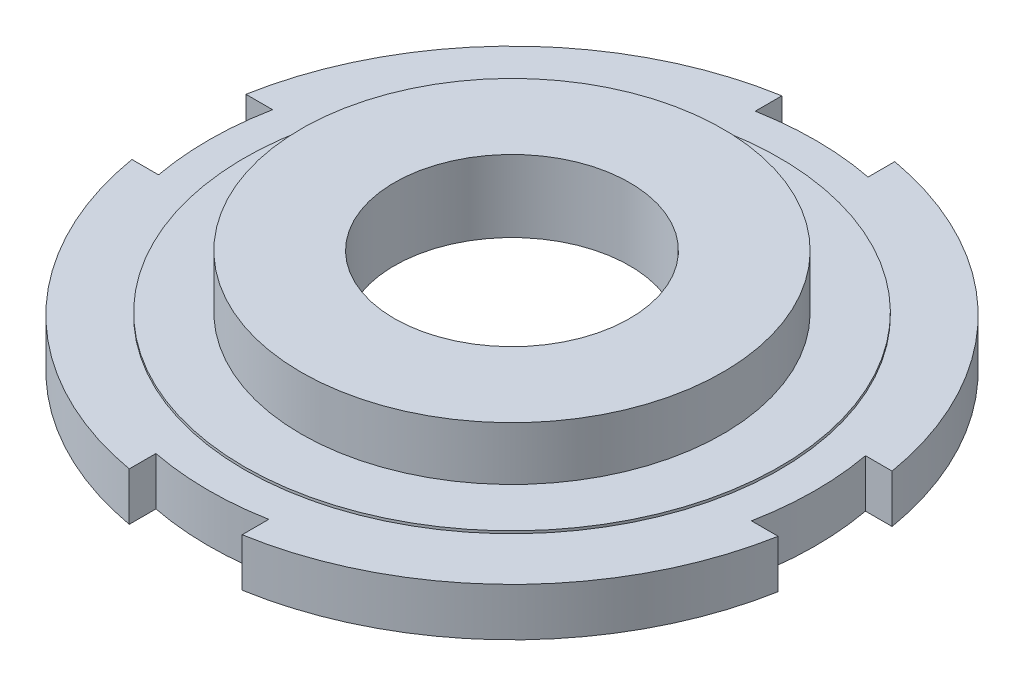
ISO-10303-21;
HEADER;
FILE_DESCRIPTION(('STEP AP214'),'2;1');
FILE_NAME('part.step','',(''),(''),'','','');
FILE_SCHEMA(('AUTOMOTIVE_DESIGN { 1 0 10303 214 1 1 1 1 }'));
ENDSEC;
DATA;
#1=APPLICATION_CONTEXT('core data for automotive mechanical design processes');
#2=APPLICATION_PROTOCOL_DEFINITION('international standard','automotive_design',2000,#1);
#3=PRODUCT_CONTEXT('',#1,'mechanical');
#4=PRODUCT('Part','Part','',(#3));
#5=PRODUCT_RELATED_PRODUCT_CATEGORY('part','',(#4));
#6=PRODUCT_DEFINITION_FORMATION('','',#4);
#7=PRODUCT_DEFINITION_CONTEXT('part definition',#1,'design');
#8=PRODUCT_DEFINITION('design','',#6,#7);
#9=PRODUCT_DEFINITION_SHAPE('','',#8);
#10=(LENGTH_UNIT() NAMED_UNIT(*) SI_UNIT(.MILLI.,.METRE.));
#11=(NAMED_UNIT(*) PLANE_ANGLE_UNIT() SI_UNIT($,.RADIAN.));
#12=(NAMED_UNIT(*) SI_UNIT($,.STERADIAN.) SOLID_ANGLE_UNIT());
#13=UNCERTAINTY_MEASURE_WITH_UNIT(LENGTH_MEASURE(1.E-05),#10,'distance_accuracy_value','');
#14=(GEOMETRIC_REPRESENTATION_CONTEXT(3) GLOBAL_UNCERTAINTY_ASSIGNED_CONTEXT((#13)) GLOBAL_UNIT_ASSIGNED_CONTEXT((#10,
#11,#12)) REPRESENTATION_CONTEXT('',''));
#15=CARTESIAN_POINT('',(0.,0.,0.));
#16=DIRECTION('',(0.,0.,1.));
#17=DIRECTION('',(1.,0.,0.));
#18=AXIS2_PLACEMENT_3D('',#15,#16,#17);
#19=CARTESIAN_POINT('',(0.,6.0000007,0.));
#20=DIRECTION('',(0.,1.,0.));
#21=DIRECTION('',(0.,0.,1.));
#22=AXIS2_PLACEMENT_3D('',#19,#20,#21);
#23=PLANE('',#22);
#24=CARTESIAN_POINT('',(0.,6.0000007,0.));
#25=DIRECTION('',(0.,1.,0.));
#26=DIRECTION('',(0.,0.,1.));
#27=AXIS2_PLACEMENT_3D('',#24,#25,#26);
#28=CIRCLE('',#27,25.019);
#29=CARTESIAN_POINT('',(0.,6.0000007,25.019));
#30=VERTEX_POINT('',#29);
#31=EDGE_CURVE('E347',#30,#30,#28,.T.);
#32=ORIENTED_EDGE('',*,*,#31,.F.);
#33=EDGE_LOOP('',(#32));
#34=FACE_BOUND('',#33,.T.);
#35=CARTESIAN_POINT('',(0.,6.0000007,0.));
#36=DIRECTION('',(0.,1.,0.));
#37=DIRECTION('',(0.,0.,1.));
#38=AXIS2_PLACEMENT_3D('',#35,#36,#37);
#39=CIRCLE('',#38,31.75);
#40=CARTESIAN_POINT('',(0.,6.0000007,31.75));
#41=VERTEX_POINT('',#40);
#42=EDGE_CURVE('E407',#41,#41,#39,.T.);
#43=ORIENTED_EDGE('',*,*,#42,.T.);
#44=EDGE_LOOP('',(#43));
#45=FACE_BOUND('',#44,.T.);
#46=ADVANCED_FACE('F37',(#34,#45),#23,.T.);
#47=CARTESIAN_POINT('',(0.,6.0000007,0.));
#48=DIRECTION('',(0.,-1.,0.));
#49=DIRECTION('',(0.,0.,-1.));
#50=AXIS2_PLACEMENT_3D('',#47,#48,#49);
#51=CYLINDRICAL_SURFACE('',#50,36.0045);
#52=CARTESIAN_POINT('',(0.,5.7000007,0.));
#53=DIRECTION('',(0.,1.,0.));
#54=DIRECTION('',(0.,0.,1.));
#55=AXIS2_PLACEMENT_3D('',#52,#53,#54);
#56=CIRCLE('',#55,36.0045);
#57=CARTESIAN_POINT('',(35.332942956963,5.7000007,6.9215));
#58=VERTEX_POINT('',#57);
#59=CARTESIAN_POINT('',(35.4054498629801,5.7000007,-6.5405));
#60=VERTEX_POINT('',#59);
#61=EDGE_CURVE('E185',#58,#60,#56,.T.);
#62=ORIENTED_EDGE('',*,*,#61,.F.);
#63=DIRECTION('',(0.,-1.,0.));
#64=VECTOR('',#63,1.);
#65=CARTESIAN_POINT('',(35.332942956963,6.0000007,6.9215));
#66=LINE('',#65,#64);
#67=CARTESIAN_POINT('',(35.332942956963,0.,6.9215));
#68=VERTEX_POINT('',#67);
#69=EDGE_CURVE('E193',#58,#68,#66,.T.);
#70=ORIENTED_EDGE('',*,*,#69,.T.);
#71=CARTESIAN_POINT('',(0.,0.,0.));
#72=DIRECTION('',(0.,1.,0.));
#73=DIRECTION('',(0.,0.,1.));
#74=AXIS2_PLACEMENT_3D('',#71,#72,#73);
#75=CIRCLE('',#74,36.0045);
#76=CARTESIAN_POINT('',(35.4054498629801,0.,-6.5405));
#77=VERTEX_POINT('',#76);
#78=EDGE_CURVE('E286',#68,#77,#75,.T.);
#79=ORIENTED_EDGE('',*,*,#78,.T.);
#80=DIRECTION('',(0.,-1.,0.));
#81=VECTOR('',#80,1.);
#82=CARTESIAN_POINT('',(35.4054498629801,6.0000007,-6.5405));
#83=LINE('',#82,#81);
#84=EDGE_CURVE('E195',#60,#77,#83,.T.);
#85=ORIENTED_EDGE('',*,*,#84,.F.);
#86=EDGE_LOOP('',(#62,#70,#79,#85));
#87=FACE_BOUND('',#86,.T.);
#88=ADVANCED_FACE('F39',(#87),#51,.T.);
#89=CARTESIAN_POINT('',(35.4054498629801,6.0000007,-6.5405));
#90=DIRECTION('',(0.,0.,-1.));
#91=DIRECTION('',(-1.,0.,0.));
#92=AXIS2_PLACEMENT_3D('',#89,#90,#91);
#93=PLANE('',#92);
#94=DIRECTION('',(1.,0.,0.));
#95=VECTOR('',#94,1.);
#96=CARTESIAN_POINT('',(35.4054498629801,5.7000007,-6.5405));
#97=LINE('',#96,#95);
#98=CARTESIAN_POINT('',(38.5653123382918,5.7000007,-6.5405));
#99=VERTEX_POINT('',#98);
#100=EDGE_CURVE('E197',#60,#99,#97,.T.);
#101=ORIENTED_EDGE('',*,*,#100,.F.);
#102=ORIENTED_EDGE('',*,*,#84,.T.);
#103=DIRECTION('',(1.,0.,0.));
#104=VECTOR('',#103,1.);
#105=CARTESIAN_POINT('',(35.4054498629801,0.,-6.5405));
#106=LINE('',#105,#104);
#107=CARTESIAN_POINT('',(38.5653123382918,0.,-6.5405));
#108=VERTEX_POINT('',#107);
#109=EDGE_CURVE('E288',#77,#108,#106,.T.);
#110=ORIENTED_EDGE('',*,*,#109,.T.);
#111=DIRECTION('',(0.,-1.,0.));
#112=VECTOR('',#111,1.);
#113=CARTESIAN_POINT('',(38.5653123382918,6.0000007,-6.5405));
#114=LINE('',#113,#112);
#115=EDGE_CURVE('E234',#99,#108,#114,.T.);
#116=ORIENTED_EDGE('',*,*,#115,.F.);
#117=EDGE_LOOP('',(#101,#102,#110,#116));
#118=FACE_BOUND('',#117,.T.);
#119=ADVANCED_FACE('F337',(#118),#93,.F.);
#120=CARTESIAN_POINT('',(0.,6.0000007,0.));
#121=DIRECTION('',(0.,-1.,0.));
#122=DIRECTION('',(0.,0.,-1.));
#123=AXIS2_PLACEMENT_3D('',#120,#121,#122);
#124=CYLINDRICAL_SURFACE('',#123,39.116);
#125=CARTESIAN_POINT('',(0.,5.7000007,0.));
#126=DIRECTION('',(0.,1.,0.));
#127=DIRECTION('',(0.,0.,1.));
#128=AXIS2_PLACEMENT_3D('',#125,#126,#127);
#129=CIRCLE('',#128,39.116);
#130=CARTESIAN_POINT('',(6.92149999999999,5.7000007,-38.4987570416241));
#131=VERTEX_POINT('',#130);
#132=EDGE_CURVE('E339',#99,#131,#129,.T.);
#133=ORIENTED_EDGE('',*,*,#132,.F.);
#134=ORIENTED_EDGE('',*,*,#115,.T.);
#135=CARTESIAN_POINT('',(0.,0.,0.));
#136=DIRECTION('',(0.,1.,0.));
#137=DIRECTION('',(0.,0.,1.));
#138=AXIS2_PLACEMENT_3D('',#135,#136,#137);
#139=CIRCLE('',#138,39.116);
#140=CARTESIAN_POINT('',(6.92149999999998,0.,-38.4987570416241));
#141=VERTEX_POINT('',#140);
#142=EDGE_CURVE('E291',#108,#141,#139,.T.);
#143=ORIENTED_EDGE('',*,*,#142,.T.);
#144=DIRECTION('',(0.,-1.,0.));
#145=VECTOR('',#144,1.);
#146=CARTESIAN_POINT('',(6.92149999999998,6.0000007,-38.4987570416241));
#147=LINE('',#146,#145);
#148=EDGE_CURVE('E232',#131,#141,#147,.T.);
#149=ORIENTED_EDGE('',*,*,#148,.F.);
#150=EDGE_LOOP('',(#133,#134,#143,#149));
#151=FACE_BOUND('',#150,.T.);
#152=ADVANCED_FACE('F381',(#151),#124,.T.);
#153=CARTESIAN_POINT('',(6.92149999999999,6.0000007,-35.332942956963));
#154=DIRECTION('',(1.,0.,0.));
#155=DIRECTION('',(0.,0.,-1.));
#156=AXIS2_PLACEMENT_3D('',#153,#154,#155);
#157=PLANE('',#156);
#158=DIRECTION('',(0.,0.,1.));
#159=VECTOR('',#158,1.);
#160=CARTESIAN_POINT('',(6.92149999999999,5.7000007,-35.332942956963));
#161=LINE('',#160,#159);
#162=CARTESIAN_POINT('',(6.92149999999999,5.7000007,-35.332942956963));
#163=VERTEX_POINT('',#162);
#164=EDGE_CURVE('E341',#131,#163,#161,.T.);
#165=ORIENTED_EDGE('',*,*,#164,.F.);
#166=ORIENTED_EDGE('',*,*,#148,.T.);
#167=DIRECTION('',(0.,0.,1.));
#168=VECTOR('',#167,1.);
#169=CARTESIAN_POINT('',(6.92149999999999,0.,-35.332942956963));
#170=LINE('',#169,#168);
#171=CARTESIAN_POINT('',(6.92149999999999,0.,-35.332942956963));
#172=VERTEX_POINT('',#171);
#173=EDGE_CURVE('E294',#141,#172,#170,.T.);
#174=ORIENTED_EDGE('',*,*,#173,.T.);
#175=DIRECTION('',(0.,-1.,0.));
#176=VECTOR('',#175,1.);
#177=CARTESIAN_POINT('',(6.92149999999999,6.0000007,-35.332942956963));
#178=LINE('',#177,#176);
#179=EDGE_CURVE('E230',#163,#172,#178,.T.);
#180=ORIENTED_EDGE('',*,*,#179,.F.);
#181=EDGE_LOOP('',(#165,#166,#174,#180));
#182=FACE_BOUND('',#181,.T.);
#183=ADVANCED_FACE('F378',(#182),#157,.F.);
#184=CARTESIAN_POINT('',(0.,6.0000007,0.));
#185=DIRECTION('',(0.,-1.,0.));
#186=DIRECTION('',(0.,0.,-1.));
#187=AXIS2_PLACEMENT_3D('',#184,#185,#186);
#188=CYLINDRICAL_SURFACE('',#187,36.0045);
#189=CARTESIAN_POINT('',(0.,5.7000007,0.));
#190=DIRECTION('',(0.,1.,0.));
#191=DIRECTION('',(0.,0.,1.));
#192=AXIS2_PLACEMENT_3D('',#189,#190,#191);
#193=CIRCLE('',#192,36.0045);
#194=CARTESIAN_POINT('',(-6.54050000000001,5.7000007,-35.4054498629801));
#195=VERTEX_POINT('',#194);
#196=EDGE_CURVE('E382',#163,#195,#193,.T.);
#197=ORIENTED_EDGE('',*,*,#196,.F.);
#198=ORIENTED_EDGE('',*,*,#179,.T.);
#199=CARTESIAN_POINT('',(0.,0.,0.));
#200=DIRECTION('',(0.,1.,0.));
#201=DIRECTION('',(0.,0.,1.));
#202=AXIS2_PLACEMENT_3D('',#199,#200,#201);
#203=CIRCLE('',#202,36.0045);
#204=CARTESIAN_POINT('',(2.43042801212387,0.,-35.9223751988629));
#205=VERTEX_POINT('',#204);
#206=EDGE_CURVE('E297',#172,#205,#203,.T.);
#207=ORIENTED_EDGE('',*,*,#206,.T.);
#208=DIRECTION('',(0.,-1.,0.));
#209=VECTOR('',#208,1.);
#210=CARTESIAN_POINT('',(2.43042801212387,6.0000007,-35.9223751988629));
#211=LINE('',#210,#209);
#212=CARTESIAN_POINT('',(2.43042801212387,3.81,-35.9223751988629));
#213=VERTEX_POINT('',#212);
#214=EDGE_CURVE('E245',#205,#213,#211,.F.);
#215=ORIENTED_EDGE('',*,*,#214,.T.);
#216=CARTESIAN_POINT('',(0.,3.81,0.));
#217=DIRECTION('',(0.,1.,0.));
#218=DIRECTION('',(0.,0.,1.));
#219=AXIS2_PLACEMENT_3D('',#216,#217,#218);
#220=CIRCLE('',#219,36.0045);
#221=CARTESIAN_POINT('',(-1.98478682303275,3.81,-35.949751619686));
#222=VERTEX_POINT('',#221);
#223=EDGE_CURVE('E241',#213,#222,#220,.T.);
#224=ORIENTED_EDGE('',*,*,#223,.T.);
#225=DIRECTION('',(0.,-1.,0.));
#226=VECTOR('',#225,1.);
#227=CARTESIAN_POINT('',(-1.98478682303275,6.0000007,-35.949751619686));
#228=LINE('',#227,#226);
#229=CARTESIAN_POINT('',(-1.98478682303275,0.,-35.949751619686));
#230=VERTEX_POINT('',#229);
#231=EDGE_CURVE('E237',#222,#230,#228,.T.);
#232=ORIENTED_EDGE('',*,*,#231,.T.);
#233=CARTESIAN_POINT('',(-6.5405,0.,-35.4054498629801));
#234=VERTEX_POINT('',#233);
#235=EDGE_CURVE('E267',#230,#234,#203,.T.);
#236=ORIENTED_EDGE('',*,*,#235,.T.);
#237=DIRECTION('',(0.,-1.,0.));
#238=VECTOR('',#237,1.);
#239=CARTESIAN_POINT('',(-6.5405,6.0000007,-35.4054498629801));
#240=LINE('',#239,#238);
#241=EDGE_CURVE('E228',#195,#234,#240,.T.);
#242=ORIENTED_EDGE('',*,*,#241,.F.);
#243=EDGE_LOOP('',(#197,#198,#207,#215,#224,#232,#236,#242));
#244=FACE_BOUND('',#243,.T.);
#245=ADVANCED_FACE('F373',(#244),#188,.T.);
#246=CARTESIAN_POINT('',(-6.54050000000001,6.0000007,-35.4054498629801));
#247=DIRECTION('',(-1.,0.,0.));
#248=DIRECTION('',(0.,0.,1.));
#249=AXIS2_PLACEMENT_3D('',#246,#247,#248);
#250=PLANE('',#249);
#251=DIRECTION('',(0.,0.,-1.));
#252=VECTOR('',#251,1.);
#253=CARTESIAN_POINT('',(-6.54050000000001,5.7000007,-35.4054498629801));
#254=LINE('',#253,#252);
#255=CARTESIAN_POINT('',(-6.54050000000001,5.7000007,-38.5653123382918));
#256=VERTEX_POINT('',#255);
#257=EDGE_CURVE('E385',#195,#256,#254,.T.);
#258=ORIENTED_EDGE('',*,*,#257,.F.);
#259=ORIENTED_EDGE('',*,*,#241,.T.);
#260=DIRECTION('',(0.,0.,-1.));
#261=VECTOR('',#260,1.);
#262=CARTESIAN_POINT('',(-6.54050000000001,0.,-35.4054498629801));
#263=LINE('',#262,#261);
#264=CARTESIAN_POINT('',(-6.54050000000001,0.,-38.5653123382918));
#265=VERTEX_POINT('',#264);
#266=EDGE_CURVE('E300',#234,#265,#263,.T.);
#267=ORIENTED_EDGE('',*,*,#266,.T.);
#268=DIRECTION('',(0.,-1.,0.));
#269=VECTOR('',#268,1.);
#270=CARTESIAN_POINT('',(-6.54050000000001,6.0000007,-38.5653123382918));
#271=LINE('',#270,#269);
#272=EDGE_CURVE('E226',#256,#265,#271,.T.);
#273=ORIENTED_EDGE('',*,*,#272,.F.);
#274=EDGE_LOOP('',(#258,#259,#267,#273));
#275=FACE_BOUND('',#274,.T.);
#276=ADVANCED_FACE('F477',(#275),#250,.F.);
#277=CARTESIAN_POINT('',(0.,6.0000007,0.));
#278=DIRECTION('',(0.,-1.,0.));
#279=DIRECTION('',(0.,0.,-1.));
#280=AXIS2_PLACEMENT_3D('',#277,#278,#279);
#281=CYLINDRICAL_SURFACE('',#280,39.116);
#282=CARTESIAN_POINT('',(0.,5.7000007,0.));
#283=DIRECTION('',(0.,1.,0.));
#284=DIRECTION('',(0.,0.,1.));
#285=AXIS2_PLACEMENT_3D('',#282,#283,#284);
#286=CIRCLE('',#285,39.116);
#287=CARTESIAN_POINT('',(-38.4987570416241,5.7000007,-6.9215));
#288=VERTEX_POINT('',#287);
#289=EDGE_CURVE('E387',#256,#288,#286,.T.);
#290=ORIENTED_EDGE('',*,*,#289,.F.);
#291=ORIENTED_EDGE('',*,*,#272,.T.);
#292=CARTESIAN_POINT('',(0.,0.,0.));
#293=DIRECTION('',(0.,1.,0.));
#294=DIRECTION('',(0.,0.,1.));
#295=AXIS2_PLACEMENT_3D('',#292,#293,#294);
#296=CIRCLE('',#295,39.116);
#297=CARTESIAN_POINT('',(-38.4987570416241,0.,-6.92149999999999));
#298=VERTEX_POINT('',#297);
#299=EDGE_CURVE('E303',#265,#298,#296,.T.);
#300=ORIENTED_EDGE('',*,*,#299,.T.);
#301=DIRECTION('',(0.,-1.,0.));
#302=VECTOR('',#301,1.);
#303=CARTESIAN_POINT('',(-38.4987570416241,6.0000007,-6.92149999999999));
#304=LINE('',#303,#302);
#305=EDGE_CURVE('E224',#288,#298,#304,.T.);
#306=ORIENTED_EDGE('',*,*,#305,.F.);
#307=EDGE_LOOP('',(#290,#291,#300,#306));
#308=FACE_BOUND('',#307,.T.);
#309=ADVANCED_FACE('F473',(#308),#281,.T.);
#310=CARTESIAN_POINT('',(-35.332942956963,6.0000007,-6.92149999999999));
#311=DIRECTION('',(0.,0.,-1.));
#312=DIRECTION('',(-1.,0.,0.));
#313=AXIS2_PLACEMENT_3D('',#310,#311,#312);
#314=PLANE('',#313);
#315=DIRECTION('',(1.,0.,0.));
#316=VECTOR('',#315,1.);
#317=CARTESIAN_POINT('',(-35.332942956963,5.7000007,-6.92149999999999));
#318=LINE('',#317,#316);
#319=CARTESIAN_POINT('',(-35.332942956963,5.7000007,-6.92149999999999));
#320=VERTEX_POINT('',#319);
#321=EDGE_CURVE('E391',#288,#320,#318,.T.);
#322=ORIENTED_EDGE('',*,*,#321,.F.);
#323=ORIENTED_EDGE('',*,*,#305,.T.);
#324=DIRECTION('',(1.,0.,0.));
#325=VECTOR('',#324,1.);
#326=CARTESIAN_POINT('',(-35.332942956963,0.,-6.92149999999999));
#327=LINE('',#326,#325);
#328=CARTESIAN_POINT('',(-35.332942956963,0.,-6.92149999999999));
#329=VERTEX_POINT('',#328);
#330=EDGE_CURVE('E306',#298,#329,#327,.T.);
#331=ORIENTED_EDGE('',*,*,#330,.T.);
#332=DIRECTION('',(0.,-1.,0.));
#333=VECTOR('',#332,1.);
#334=CARTESIAN_POINT('',(-35.332942956963,6.0000007,-6.92149999999999));
#335=LINE('',#334,#333);
#336=EDGE_CURVE('E222',#320,#329,#335,.T.);
#337=ORIENTED_EDGE('',*,*,#336,.F.);
#338=EDGE_LOOP('',(#322,#323,#331,#337));
#339=FACE_BOUND('',#338,.T.);
#340=ADVANCED_FACE('F469',(#339),#314,.F.);
#341=CARTESIAN_POINT('',(0.,6.0000007,0.));
#342=DIRECTION('',(0.,-1.,0.));
#343=DIRECTION('',(0.,0.,-1.));
#344=AXIS2_PLACEMENT_3D('',#341,#342,#343);
#345=CYLINDRICAL_SURFACE('',#344,36.0045);
#346=CARTESIAN_POINT('',(0.,5.7000007,0.));
#347=DIRECTION('',(0.,1.,0.));
#348=DIRECTION('',(0.,0.,1.));
#349=AXIS2_PLACEMENT_3D('',#346,#347,#348);
#350=CIRCLE('',#349,36.0045);
#351=CARTESIAN_POINT('',(-35.4054498629801,5.7000007,6.54050000000001));
#352=VERTEX_POINT('',#351);
#353=EDGE_CURVE('E393',#320,#352,#350,.T.);
#354=ORIENTED_EDGE('',*,*,#353,.F.);
#355=ORIENTED_EDGE('',*,*,#336,.T.);
#356=CARTESIAN_POINT('',(0.,0.,0.));
#357=DIRECTION('',(0.,1.,0.));
#358=DIRECTION('',(0.,0.,1.));
#359=AXIS2_PLACEMENT_3D('',#356,#357,#358);
#360=CIRCLE('',#359,36.0045);
#361=CARTESIAN_POINT('',(-35.4054498629801,0.,6.5405));
#362=VERTEX_POINT('',#361);
#363=EDGE_CURVE('E309',#329,#362,#360,.T.);
#364=ORIENTED_EDGE('',*,*,#363,.T.);
#365=DIRECTION('',(0.,-1.,0.));
#366=VECTOR('',#365,1.);
#367=CARTESIAN_POINT('',(-35.4054498629801,6.0000007,6.5405));
#368=LINE('',#367,#366);
#369=EDGE_CURVE('E220',#352,#362,#368,.T.);
#370=ORIENTED_EDGE('',*,*,#369,.F.);
#371=EDGE_LOOP('',(#354,#355,#364,#370));
#372=FACE_BOUND('',#371,.T.);
#373=ADVANCED_FACE('F465',(#372),#345,.T.);
#374=CARTESIAN_POINT('',(-35.4054498629801,6.0000007,6.54050000000001));
#375=DIRECTION('',(0.,0.,1.));
#376=DIRECTION('',(1.,0.,0.));
#377=AXIS2_PLACEMENT_3D('',#374,#375,#376);
#378=PLANE('',#377);
#379=DIRECTION('',(-1.,0.,0.));
#380=VECTOR('',#379,1.);
#381=CARTESIAN_POINT('',(-35.4054498629801,5.7000007,6.54050000000001));
#382=LINE('',#381,#380);
#383=CARTESIAN_POINT('',(-38.5653123382918,5.7000007,6.54050000000001));
#384=VERTEX_POINT('',#383);
#385=EDGE_CURVE('E395',#352,#384,#382,.T.);
#386=ORIENTED_EDGE('',*,*,#385,.F.);
#387=ORIENTED_EDGE('',*,*,#369,.T.);
#388=DIRECTION('',(-1.,0.,0.));
#389=VECTOR('',#388,1.);
#390=CARTESIAN_POINT('',(-35.4054498629801,0.,6.54050000000001));
#391=LINE('',#390,#389);
#392=CARTESIAN_POINT('',(-38.5653123382918,0.,6.54050000000001));
#393=VERTEX_POINT('',#392);
#394=EDGE_CURVE('E312',#362,#393,#391,.T.);
#395=ORIENTED_EDGE('',*,*,#394,.T.);
#396=DIRECTION('',(0.,-1.,0.));
#397=VECTOR('',#396,1.);
#398=CARTESIAN_POINT('',(-38.5653123382918,6.0000007,6.54050000000001));
#399=LINE('',#398,#397);
#400=EDGE_CURVE('E218',#384,#393,#399,.T.);
#401=ORIENTED_EDGE('',*,*,#400,.F.);
#402=EDGE_LOOP('',(#386,#387,#395,#401));
#403=FACE_BOUND('',#402,.T.);
#404=ADVANCED_FACE('F461',(#403),#378,.F.);
#405=CARTESIAN_POINT('',(0.,6.0000007,0.));
#406=DIRECTION('',(0.,-1.,0.));
#407=DIRECTION('',(0.,0.,-1.));
#408=AXIS2_PLACEMENT_3D('',#405,#406,#407);
#409=CYLINDRICAL_SURFACE('',#408,39.116);
#410=CARTESIAN_POINT('',(0.,5.7000007,0.));
#411=DIRECTION('',(0.,1.,0.));
#412=DIRECTION('',(0.,0.,1.));
#413=AXIS2_PLACEMENT_3D('',#410,#411,#412);
#414=CIRCLE('',#413,39.116);
#415=CARTESIAN_POINT('',(-6.9215,5.7000007,38.4987570416241));
#416=VERTEX_POINT('',#415);
#417=EDGE_CURVE('E397',#384,#416,#414,.T.);
#418=ORIENTED_EDGE('',*,*,#417,.F.);
#419=ORIENTED_EDGE('',*,*,#400,.T.);
#420=CARTESIAN_POINT('',(0.,0.,0.));
#421=DIRECTION('',(0.,1.,0.));
#422=DIRECTION('',(0.,0.,1.));
#423=AXIS2_PLACEMENT_3D('',#420,#421,#422);
#424=CIRCLE('',#423,39.116);
#425=CARTESIAN_POINT('',(-6.92149999999999,0.,38.4987570416241));
#426=VERTEX_POINT('',#425);
#427=EDGE_CURVE('E315',#393,#426,#424,.T.);
#428=ORIENTED_EDGE('',*,*,#427,.T.);
#429=DIRECTION('',(0.,-1.,0.));
#430=VECTOR('',#429,1.);
#431=CARTESIAN_POINT('',(-6.92149999999999,6.0000007,38.4987570416241));
#432=LINE('',#431,#430);
#433=EDGE_CURVE('E216',#416,#426,#432,.T.);
#434=ORIENTED_EDGE('',*,*,#433,.F.);
#435=EDGE_LOOP('',(#418,#419,#428,#434));
#436=FACE_BOUND('',#435,.T.);
#437=ADVANCED_FACE('F457',(#436),#409,.T.);
#438=CARTESIAN_POINT('',(-6.9215,6.0000007,35.332942956963));
#439=DIRECTION('',(-1.,0.,0.));
#440=DIRECTION('',(0.,0.,1.));
#441=AXIS2_PLACEMENT_3D('',#438,#439,#440);
#442=PLANE('',#441);
#443=DIRECTION('',(0.,0.,-1.));
#444=VECTOR('',#443,1.);
#445=CARTESIAN_POINT('',(-6.9215,5.7000007,35.332942956963));
#446=LINE('',#445,#444);
#447=CARTESIAN_POINT('',(-6.9215,5.7000007,35.332942956963));
#448=VERTEX_POINT('',#447);
#449=EDGE_CURVE('E399',#416,#448,#446,.T.);
#450=ORIENTED_EDGE('',*,*,#449,.F.);
#451=ORIENTED_EDGE('',*,*,#433,.T.);
#452=DIRECTION('',(0.,0.,-1.));
#453=VECTOR('',#452,1.);
#454=CARTESIAN_POINT('',(-6.9215,0.,35.332942956963));
#455=LINE('',#454,#453);
#456=CARTESIAN_POINT('',(-6.9215,0.,35.332942956963));
#457=VERTEX_POINT('',#456);
#458=EDGE_CURVE('E318',#426,#457,#455,.T.);
#459=ORIENTED_EDGE('',*,*,#458,.T.);
#460=DIRECTION('',(0.,-1.,0.));
#461=VECTOR('',#460,1.);
#462=CARTESIAN_POINT('',(-6.9215,6.0000007,35.332942956963));
#463=LINE('',#462,#461);
#464=EDGE_CURVE('E214',#448,#457,#463,.T.);
#465=ORIENTED_EDGE('',*,*,#464,.F.);
#466=EDGE_LOOP('',(#450,#451,#459,#465));
#467=FACE_BOUND('',#466,.T.);
#468=ADVANCED_FACE('F453',(#467),#442,.F.);
#469=CARTESIAN_POINT('',(0.,6.0000007,0.));
#470=DIRECTION('',(0.,-1.,0.));
#471=DIRECTION('',(0.,0.,-1.));
#472=AXIS2_PLACEMENT_3D('',#469,#470,#471);
#473=CYLINDRICAL_SURFACE('',#472,36.0045);
#474=CARTESIAN_POINT('',(0.,5.7000007,0.));
#475=DIRECTION('',(0.,1.,0.));
#476=DIRECTION('',(0.,0.,1.));
#477=AXIS2_PLACEMENT_3D('',#474,#475,#476);
#478=CIRCLE('',#477,36.0045);
#479=CARTESIAN_POINT('',(6.5405,5.7000007,35.4054498629801));
#480=VERTEX_POINT('',#479);
#481=EDGE_CURVE('E401',#448,#480,#478,.T.);
#482=ORIENTED_EDGE('',*,*,#481,.F.);
#483=ORIENTED_EDGE('',*,*,#464,.T.);
#484=CARTESIAN_POINT('',(0.,0.,0.));
#485=DIRECTION('',(0.,1.,0.));
#486=DIRECTION('',(0.,0.,1.));
#487=AXIS2_PLACEMENT_3D('',#484,#485,#486);
#488=CIRCLE('',#487,36.0045);
#489=CARTESIAN_POINT('',(6.54050000000001,0.,35.4054498629801));
#490=VERTEX_POINT('',#489);
#491=EDGE_CURVE('E321',#457,#490,#488,.T.);
#492=ORIENTED_EDGE('',*,*,#491,.T.);
#493=DIRECTION('',(0.,-1.,0.));
#494=VECTOR('',#493,1.);
#495=CARTESIAN_POINT('',(6.54050000000001,6.0000007,35.4054498629801));
#496=LINE('',#495,#494);
#497=EDGE_CURVE('E212',#480,#490,#496,.T.);
#498=ORIENTED_EDGE('',*,*,#497,.F.);
#499=EDGE_LOOP('',(#482,#483,#492,#498));
#500=FACE_BOUND('',#499,.T.);
#501=ADVANCED_FACE('F449',(#500),#473,.T.);
#502=CARTESIAN_POINT('',(6.5405,6.0000007,35.4054498629801));
#503=DIRECTION('',(1.,0.,0.));
#504=DIRECTION('',(0.,0.,-1.));
#505=AXIS2_PLACEMENT_3D('',#502,#503,#504);
#506=PLANE('',#505);
#507=DIRECTION('',(0.,0.,1.));
#508=VECTOR('',#507,1.);
#509=CARTESIAN_POINT('',(6.5405,5.7000007,35.4054498629801));
#510=LINE('',#509,#508);
#511=CARTESIAN_POINT('',(6.5405,5.7000007,38.5653123382918));
#512=VERTEX_POINT('',#511);
#513=EDGE_CURVE('E403',#480,#512,#510,.T.);
#514=ORIENTED_EDGE('',*,*,#513,.F.);
#515=ORIENTED_EDGE('',*,*,#497,.T.);
#516=DIRECTION('',(0.,0.,1.));
#517=VECTOR('',#516,1.);
#518=CARTESIAN_POINT('',(6.5405,0.,35.4054498629801));
#519=LINE('',#518,#517);
#520=CARTESIAN_POINT('',(6.5405,0.,38.5653123382918));
#521=VERTEX_POINT('',#520);
#522=EDGE_CURVE('E324',#490,#521,#519,.T.);
#523=ORIENTED_EDGE('',*,*,#522,.T.);
#524=DIRECTION('',(0.,-1.,0.));
#525=VECTOR('',#524,1.);
#526=CARTESIAN_POINT('',(6.5405,6.0000007,38.5653123382918));
#527=LINE('',#526,#525);
#528=EDGE_CURVE('E205',#512,#521,#527,.T.);
#529=ORIENTED_EDGE('',*,*,#528,.F.);
#530=EDGE_LOOP('',(#514,#515,#523,#529));
#531=FACE_BOUND('',#530,.T.);
#532=ADVANCED_FACE('F446',(#531),#506,.F.);
#533=CARTESIAN_POINT('',(0.,6.0000007,0.));
#534=DIRECTION('',(0.,-1.,0.));
#535=DIRECTION('',(0.,0.,-1.));
#536=AXIS2_PLACEMENT_3D('',#533,#534,#535);
#537=CYLINDRICAL_SURFACE('',#536,39.116);
#538=CARTESIAN_POINT('',(0.,5.7000007,0.));
#539=DIRECTION('',(0.,1.,0.));
#540=DIRECTION('',(0.,0.,1.));
#541=AXIS2_PLACEMENT_3D('',#538,#539,#540);
#542=CIRCLE('',#541,39.116);
#543=CARTESIAN_POINT('',(38.4987570416241,5.7000007,6.9215));
#544=VERTEX_POINT('',#543);
#545=EDGE_CURVE('E51',#512,#544,#542,.T.);
#546=ORIENTED_EDGE('',*,*,#545,.F.);
#547=ORIENTED_EDGE('',*,*,#528,.T.);
#548=CARTESIAN_POINT('',(0.,0.,0.));
#549=DIRECTION('',(0.,1.,0.));
#550=DIRECTION('',(0.,0.,1.));
#551=AXIS2_PLACEMENT_3D('',#548,#549,#550);
#552=CIRCLE('',#551,39.116);
#553=CARTESIAN_POINT('',(38.4987570416241,0.,6.9215));
#554=VERTEX_POINT('',#553);
#555=EDGE_CURVE('E207',#521,#554,#552,.T.);
#556=ORIENTED_EDGE('',*,*,#555,.T.);
#557=DIRECTION('',(0.,-1.,0.));
#558=VECTOR('',#557,1.);
#559=CARTESIAN_POINT('',(38.4987570416241,6.0000007,6.9215));
#560=LINE('',#559,#558);
#561=EDGE_CURVE('E203',#544,#554,#560,.T.);
#562=ORIENTED_EDGE('',*,*,#561,.F.);
#563=EDGE_LOOP('',(#546,#547,#556,#562));
#564=FACE_BOUND('',#563,.T.);
#565=ADVANCED_FACE('F329',(#564),#537,.T.);
#566=CARTESIAN_POINT('',(35.332942956963,6.0000007,6.9215));
#567=DIRECTION('',(0.,0.,1.));
#568=DIRECTION('',(1.,0.,0.));
#569=AXIS2_PLACEMENT_3D('',#566,#567,#568);
#570=PLANE('',#569);
#571=DIRECTION('',(-1.,0.,0.));
#572=VECTOR('',#571,1.);
#573=CARTESIAN_POINT('',(35.332942956963,5.7000007,6.9215));
#574=LINE('',#573,#572);
#575=EDGE_CURVE('E11',#544,#58,#574,.T.);
#576=ORIENTED_EDGE('',*,*,#575,.F.);
#577=ORIENTED_EDGE('',*,*,#561,.T.);
#578=DIRECTION('',(-1.,0.,0.));
#579=VECTOR('',#578,1.);
#580=CARTESIAN_POINT('',(35.332942956963,0.,6.9215));
#581=LINE('',#580,#579);
#582=EDGE_CURVE('E201',#554,#68,#581,.T.);
#583=ORIENTED_EDGE('',*,*,#582,.T.);
#584=ORIENTED_EDGE('',*,*,#69,.F.);
#585=EDGE_LOOP('',(#576,#577,#583,#584));
#586=FACE_BOUND('',#585,.T.);
#587=ADVANCED_FACE('F199',(#586),#570,.F.);
#588=CARTESIAN_POINT('',(0.,3.81,0.));
#589=DIRECTION('',(0.,-1.,0.));
#590=DIRECTION('',(0.,0.,-1.));
#591=AXIS2_PLACEMENT_3D('',#588,#589,#590);
#592=CYLINDRICAL_SURFACE('',#591,20.066);
#593=CARTESIAN_POINT('',(0.,0.3,0.));
#594=DIRECTION('',(0.,-1.,0.));
#595=DIRECTION('',(0.,0.,-1.));
#596=AXIS2_PLACEMENT_3D('',#593,#594,#595);
#597=CIRCLE('',#596,20.066);
#598=CARTESIAN_POINT('',(8.19621258604991,0.300000000000001,-18.3157433713261));
#599=VERTEX_POINT('',#598);
#600=CARTESIAN_POINT('',(17.3776657523386,0.3,-10.033));
#601=VERTEX_POINT('',#600);
#602=EDGE_CURVE('E248',#599,#601,#597,.F.);
#603=ORIENTED_EDGE('',*,*,#602,.F.);
#604=DIRECTION('',(0.,-1.,0.));
#605=VECTOR('',#604,1.);
#606=CARTESIAN_POINT('',(8.19621258604991,3.81,-18.3157433713261));
#607=LINE('',#606,#605);
#608=CARTESIAN_POINT('',(8.19621258604991,3.81,-18.3157433713261));
#609=VERTEX_POINT('',#608);
#610=EDGE_CURVE('E282',#609,#599,#607,.T.);
#611=ORIENTED_EDGE('',*,*,#610,.F.);
#612=CARTESIAN_POINT('',(0.,3.81,0.));
#613=DIRECTION('',(0.,-1.,0.));
#614=DIRECTION('',(0.,0.,1.));
#615=AXIS2_PLACEMENT_3D('',#612,#613,#614);
#616=CIRCLE('',#615,20.066);
#617=CARTESIAN_POINT('',(17.3776657523386,3.81,-10.033));
#618=VERTEX_POINT('',#617);
#619=EDGE_CURVE('E271',#618,#609,#616,.T.);
#620=ORIENTED_EDGE('',*,*,#619,.F.);
#621=DIRECTION('',(0.,-1.,0.));
#622=VECTOR('',#621,1.);
#623=CARTESIAN_POINT('',(17.3776657523386,3.81,-10.033));
#624=LINE('',#623,#622);
#625=EDGE_CURVE('E242',#618,#601,#624,.T.);
#626=ORIENTED_EDGE('',*,*,#625,.T.);
#627=EDGE_LOOP('',(#603,#611,#620,#626));
#628=FACE_BOUND('',#627,.T.);
#629=ADVANCED_FACE('F370',(#628),#592,.F.);
#630=CARTESIAN_POINT('',(0.,0.,0.));
#631=DIRECTION('',(0.,1.,0.));
#632=DIRECTION('',(0.,0.,1.));
#633=AXIS2_PLACEMENT_3D('',#630,#631,#632);
#634=PLANE('',#633);
#635=DIRECTION('',(-0.500000000000001,0.,-0.866025403784438));
#636=VECTOR('',#635,1.);
#637=CARTESIAN_POINT('',(-4.5396617454955,0.,-40.374924792375));
#638=LINE('',#637,#636);
#639=CARTESIAN_POINT('',(0.441714975771824,0.,-31.7469272194992));
#640=VERTEX_POINT('',#639);
#641=EDGE_CURVE('E254',#640,#230,#638,.T.);
#642=ORIENTED_EDGE('',*,*,#641,.F.);
#643=CARTESIAN_POINT('',(0.,0.,0.));
#644=DIRECTION('',(0.,-1.,0.));
#645=DIRECTION('',(0.,0.,-1.));
#646=AXIS2_PLACEMENT_3D('',#643,#644,#645);
#647=CIRCLE('',#646,31.75);
#648=CARTESIAN_POINT('',(5.07504261741328,0.,-31.341768336063));
#649=VERTEX_POINT('',#648);
#650=EDGE_CURVE('E263',#649,#640,#647,.T.);
#651=ORIENTED_EDGE('',*,*,#650,.F.);
#652=DIRECTION('',(0.499999999999999,0.,0.866025403784439));
#653=VECTOR('',#652,1.);
#654=CARTESIAN_POINT('',(17.3776657523386,0.,-10.033));
#655=LINE('',#654,#653);
#656=EDGE_CURVE('E268',#205,#649,#655,.T.);
#657=ORIENTED_EDGE('',*,*,#656,.F.);
#658=ORIENTED_EDGE('',*,*,#206,.F.);
#659=ORIENTED_EDGE('',*,*,#173,.F.);
#660=ORIENTED_EDGE('',*,*,#142,.F.);
#661=ORIENTED_EDGE('',*,*,#109,.F.);
#662=ORIENTED_EDGE('',*,*,#78,.F.);
#663=ORIENTED_EDGE('',*,*,#582,.F.);
#664=ORIENTED_EDGE('',*,*,#555,.F.);
#665=ORIENTED_EDGE('',*,*,#522,.F.);
#666=ORIENTED_EDGE('',*,*,#491,.F.);
#667=ORIENTED_EDGE('',*,*,#458,.F.);
#668=ORIENTED_EDGE('',*,*,#427,.F.);
#669=ORIENTED_EDGE('',*,*,#394,.F.);
#670=ORIENTED_EDGE('',*,*,#363,.F.);
#671=ORIENTED_EDGE('',*,*,#330,.F.);
#672=ORIENTED_EDGE('',*,*,#299,.F.);
#673=ORIENTED_EDGE('',*,*,#266,.F.);
#674=ORIENTED_EDGE('',*,*,#235,.F.);
#675=EDGE_LOOP('',(#642,#651,#657,#658,#659,#660,#661,#662,#663,#664,#665,#666,#667,#668,#669,
#670,#671,#672,#673,#674));
#676=FACE_BOUND('',#675,.T.);
#677=ADVANCED_FACE('F261',(#676),#634,.F.);
#678=CARTESIAN_POINT('',(0.,6.0000007,0.));
#679=DIRECTION('',(0.,-1.,0.));
#680=DIRECTION('',(0.,0.,-1.));
#681=AXIS2_PLACEMENT_3D('',#678,#679,#680);
#682=CYLINDRICAL_SURFACE('',#681,13.97);
#683=CARTESIAN_POINT('',(0.,3.81,0.));
#684=DIRECTION('',(0.,1.,0.));
#685=DIRECTION('',(0.,0.,1.));
#686=AXIS2_PLACEMENT_3D('',#683,#684,#685);
#687=CIRCLE('',#686,13.97);
#688=CARTESIAN_POINT('',(0.,3.81,13.97));
#689=VERTEX_POINT('',#688);
#690=EDGE_CURVE('E238',#689,#689,#687,.T.);
#691=ORIENTED_EDGE('',*,*,#690,.F.);
#692=EDGE_LOOP('',(#691));
#693=FACE_BOUND('',#692,.T.);
#694=CARTESIAN_POINT('',(0.,12.3500007,0.));
#695=DIRECTION('',(0.,1.,0.));
#696=DIRECTION('',(0.,0.,1.));
#697=AXIS2_PLACEMENT_3D('',#694,#695,#696);
#698=CIRCLE('',#697,13.97);
#699=CARTESIAN_POINT('',(0.,12.3500007,13.97));
#700=VERTEX_POINT('',#699);
#701=EDGE_CURVE('E196',#700,#700,#698,.T.);
#702=ORIENTED_EDGE('',*,*,#701,.T.);
#703=EDGE_LOOP('',(#702));
#704=FACE_BOUND('',#703,.T.);
#705=ADVANCED_FACE('F438',(#693,#704),#682,.F.);
#706=CARTESIAN_POINT('',(17.3776657523386,3.81,-10.033));
#707=DIRECTION('',(0.866025403784439,0.,-0.499999999999999));
#708=DIRECTION('',(-0.499999999999999,0.,-0.866025403784439));
#709=AXIS2_PLACEMENT_3D('',#706,#707,#708);
#710=PLANE('',#709);
#711=ORIENTED_EDGE('',*,*,#656,.T.);
#712=DIRECTION('',(0.,-1.,0.));
#713=VECTOR('',#712,1.);
#714=CARTESIAN_POINT('',(5.07504261741328,0.3,-31.341768336063));
#715=LINE('',#714,#713);
#716=CARTESIAN_POINT('',(5.07504261741328,0.3,-31.341768336063));
#717=VERTEX_POINT('',#716);
#718=EDGE_CURVE('E269',#649,#717,#715,.F.);
#719=ORIENTED_EDGE('',*,*,#718,.T.);
#720=DIRECTION('',(-0.499999999999999,0.,-0.866025403784439));
#721=VECTOR('',#720,1.);
#722=CARTESIAN_POINT('',(17.3776657523386,0.3,-10.033));
#723=LINE('',#722,#721);
#724=EDGE_CURVE('E274',#601,#717,#723,.T.);
#725=ORIENTED_EDGE('',*,*,#724,.F.);
#726=ORIENTED_EDGE('',*,*,#625,.F.);
#727=DIRECTION('',(0.499999999999999,0.,0.866025403784439));
#728=VECTOR('',#727,1.);
#729=CARTESIAN_POINT('',(17.3776657523386,3.81,-10.033));
#730=LINE('',#729,#728);
#731=EDGE_CURVE('E277',#213,#618,#730,.T.);
#732=ORIENTED_EDGE('',*,*,#731,.F.);
#733=ORIENTED_EDGE('',*,*,#214,.F.);
#734=EDGE_LOOP('',(#711,#719,#725,#726,#732,#733));
#735=FACE_BOUND('',#734,.T.);
#736=ADVANCED_FACE('F368',(#735),#710,.F.);
#737=CARTESIAN_POINT('',(-4.5396617454955,3.81,-40.374924792375));
#738=DIRECTION('',(-0.866025403784438,0.,0.500000000000001));
#739=DIRECTION('',(0.500000000000001,0.,0.866025403784438));
#740=AXIS2_PLACEMENT_3D('',#737,#738,#739);
#741=PLANE('',#740);
#742=DIRECTION('',(0.500000000000001,0.,0.866025403784438));
#743=VECTOR('',#742,1.);
#744=CARTESIAN_POINT('',(-4.5396617454955,0.3,-40.374924792375));
#745=LINE('',#744,#743);
#746=CARTESIAN_POINT('',(0.441714975771824,0.3,-31.7469272194992));
#747=VERTEX_POINT('',#746);
#748=EDGE_CURVE('E59',#747,#599,#745,.T.);
#749=ORIENTED_EDGE('',*,*,#748,.F.);
#750=DIRECTION('',(0.,-1.,0.));
#751=VECTOR('',#750,1.);
#752=CARTESIAN_POINT('',(0.441714975771824,0.3,-31.7469272194992));
#753=LINE('',#752,#751);
#754=EDGE_CURVE('E45',#747,#640,#753,.T.);
#755=ORIENTED_EDGE('',*,*,#754,.T.);
#756=ORIENTED_EDGE('',*,*,#641,.T.);
#757=ORIENTED_EDGE('',*,*,#231,.F.);
#758=DIRECTION('',(-0.500000000000001,0.,-0.866025403784438));
#759=VECTOR('',#758,1.);
#760=CARTESIAN_POINT('',(-4.5396617454955,3.81,-40.374924792375));
#761=LINE('',#760,#759);
#762=EDGE_CURVE('E359',#609,#222,#761,.T.);
#763=ORIENTED_EDGE('',*,*,#762,.F.);
#764=ORIENTED_EDGE('',*,*,#610,.T.);
#765=EDGE_LOOP('',(#749,#755,#756,#757,#763,#764));
#766=FACE_BOUND('',#765,.T.);
#767=ADVANCED_FACE('F252',(#766),#741,.F.);
#768=CARTESIAN_POINT('',(0.,3.81,0.));
#769=DIRECTION('',(0.,1.,0.));
#770=DIRECTION('',(0.,0.,1.));
#771=AXIS2_PLACEMENT_3D('',#768,#769,#770);
#772=PLANE('',#771);
#773=ORIENTED_EDGE('',*,*,#690,.T.);
#774=EDGE_LOOP('',(#773));
#775=FACE_BOUND('',#774,.T.);
#776=ORIENTED_EDGE('',*,*,#731,.T.);
#777=ORIENTED_EDGE('',*,*,#619,.T.);
#778=ORIENTED_EDGE('',*,*,#762,.T.);
#779=ORIENTED_EDGE('',*,*,#223,.F.);
#780=EDGE_LOOP('',(#776,#777,#778,#779));
#781=FACE_BOUND('',#780,.T.);
#782=ADVANCED_FACE('F364',(#775,#781),#772,.F.);
#783=CARTESIAN_POINT('',(0.,0.3,0.));
#784=DIRECTION('',(0.,-1.,0.));
#785=DIRECTION('',(0.,0.,-1.));
#786=AXIS2_PLACEMENT_3D('',#783,#784,#785);
#787=CYLINDRICAL_SURFACE('',#786,31.75);
#788=ORIENTED_EDGE('',*,*,#650,.T.);
#789=ORIENTED_EDGE('',*,*,#754,.F.);
#790=CARTESIAN_POINT('',(0.,0.3,0.));
#791=DIRECTION('',(0.,-1.,0.));
#792=DIRECTION('',(0.,0.,-1.));
#793=AXIS2_PLACEMENT_3D('',#790,#791,#792);
#794=CIRCLE('',#793,31.75);
#795=EDGE_CURVE('E353',#717,#747,#794,.T.);
#796=ORIENTED_EDGE('',*,*,#795,.F.);
#797=ORIENTED_EDGE('',*,*,#718,.F.);
#798=EDGE_LOOP('',(#788,#789,#796,#797));
#799=FACE_BOUND('',#798,.T.);
#800=ADVANCED_FACE('F584',(#799),#787,.F.);
#801=CARTESIAN_POINT('',(0.,0.3,0.));
#802=DIRECTION('',(0.,-1.,0.));
#803=DIRECTION('',(0.,0.,-1.));
#804=AXIS2_PLACEMENT_3D('',#801,#802,#803);
#805=PLANE('',#804);
#806=ORIENTED_EDGE('',*,*,#724,.T.);
#807=ORIENTED_EDGE('',*,*,#795,.T.);
#808=ORIENTED_EDGE('',*,*,#748,.T.);
#809=ORIENTED_EDGE('',*,*,#602,.T.);
#810=EDGE_LOOP('',(#806,#807,#808,#809));
#811=FACE_BOUND('',#810,.T.);
#812=ADVANCED_FACE('F591',(#811),#805,.T.);
#813=CARTESIAN_POINT('',(0.,12.3500007,0.));
#814=DIRECTION('',(0.,1.,0.));
#815=DIRECTION('',(0.,0.,1.));
#816=AXIS2_PLACEMENT_3D('',#813,#814,#815);
#817=PLANE('',#816);
#818=CARTESIAN_POINT('',(0.,12.3500007,0.));
#819=DIRECTION('',(0.,1.,0.));
#820=DIRECTION('',(0.,0.,1.));
#821=AXIS2_PLACEMENT_3D('',#818,#819,#820);
#822=CIRCLE('',#821,25.019);
#823=CARTESIAN_POINT('',(0.,12.3500007,25.019));
#824=VERTEX_POINT('',#823);
#825=EDGE_CURVE('E348',#824,#824,#822,.T.);
#826=ORIENTED_EDGE('',*,*,#825,.T.);
#827=EDGE_LOOP('',(#826));
#828=FACE_BOUND('',#827,.T.);
#829=ORIENTED_EDGE('',*,*,#701,.F.);
#830=EDGE_LOOP('',(#829));
#831=FACE_BOUND('',#830,.T.);
#832=ADVANCED_FACE('F424',(#828,#831),#817,.T.);
#833=CARTESIAN_POINT('',(0.,12.3500007,0.));
#834=DIRECTION('',(0.,-1.,0.));
#835=DIRECTION('',(0.,0.,-1.));
#836=AXIS2_PLACEMENT_3D('',#833,#834,#835);
#837=CYLINDRICAL_SURFACE('',#836,25.019);
#838=ORIENTED_EDGE('',*,*,#825,.F.);
#839=EDGE_LOOP('',(#838));
#840=FACE_BOUND('',#839,.T.);
#841=ORIENTED_EDGE('',*,*,#31,.T.);
#842=EDGE_LOOP('',(#841));
#843=FACE_BOUND('',#842,.T.);
#844=ADVANCED_FACE('F417',(#840,#843),#837,.T.);
#845=CARTESIAN_POINT('',(0.,5.7000007,0.));
#846=DIRECTION('',(0.,1.,0.));
#847=DIRECTION('',(0.,0.,1.));
#848=AXIS2_PLACEMENT_3D('',#845,#846,#847);
#849=PLANE('',#848);
#850=CARTESIAN_POINT('',(0.,5.7000007,0.));
#851=DIRECTION('',(0.,1.,0.));
#852=DIRECTION('',(0.,0.,1.));
#853=AXIS2_PLACEMENT_3D('',#850,#851,#852);
#854=CIRCLE('',#853,31.75);
#855=CARTESIAN_POINT('',(0.,5.7000007,31.75));
#856=VERTEX_POINT('',#855);
#857=EDGE_CURVE('E406',#856,#856,#854,.T.);
#858=ORIENTED_EDGE('',*,*,#857,.F.);
#859=EDGE_LOOP('',(#858));
#860=FACE_BOUND('',#859,.T.);
#861=ORIENTED_EDGE('',*,*,#61,.T.);
#862=ORIENTED_EDGE('',*,*,#100,.T.);
#863=ORIENTED_EDGE('',*,*,#132,.T.);
#864=ORIENTED_EDGE('',*,*,#164,.T.);
#865=ORIENTED_EDGE('',*,*,#196,.T.);
#866=ORIENTED_EDGE('',*,*,#257,.T.);
#867=ORIENTED_EDGE('',*,*,#289,.T.);
#868=ORIENTED_EDGE('',*,*,#321,.T.);
#869=ORIENTED_EDGE('',*,*,#353,.T.);
#870=ORIENTED_EDGE('',*,*,#385,.T.);
#871=ORIENTED_EDGE('',*,*,#417,.T.);
#872=ORIENTED_EDGE('',*,*,#449,.T.);
#873=ORIENTED_EDGE('',*,*,#481,.T.);
#874=ORIENTED_EDGE('',*,*,#513,.T.);
#875=ORIENTED_EDGE('',*,*,#545,.T.);
#876=ORIENTED_EDGE('',*,*,#575,.T.);
#877=EDGE_LOOP('',(#861,#862,#863,#864,#865,#866,#867,#868,#869,#870,#871,#872,#873,#874,#875,#876));
#878=FACE_BOUND('',#877,.T.);
#879=ADVANCED_FACE('F184',(#860,#878),#849,.T.);
#880=CARTESIAN_POINT('',(0.,5.7000007,0.));
#881=DIRECTION('',(0.,1.,0.));
#882=DIRECTION('',(0.,0.,1.));
#883=AXIS2_PLACEMENT_3D('',#880,#881,#882);
#884=CYLINDRICAL_SURFACE('',#883,31.75);
#885=ORIENTED_EDGE('',*,*,#857,.T.);
#886=EDGE_LOOP('',(#885));
#887=FACE_BOUND('',#886,.T.);
#888=ORIENTED_EDGE('',*,*,#42,.F.);
#889=EDGE_LOOP('',(#888));
#890=FACE_BOUND('',#889,.T.);
#891=ADVANCED_FACE('F413',(#887,#890),#884,.T.);
#892=CLOSED_SHELL('',(#46,#88,#119,#152,#183,#245,#276,#309,#340,#373,#404,#437,#468,#501,#532,
#565,#587,#629,#677,#705,#736,#767,#782,#800,#812,#832,#844,#879,#891));
#893=MANIFOLD_SOLID_BREP('B2',#892);
#894=ADVANCED_BREP_SHAPE_REPRESENTATION('',(#18,#893),#14);
#895=SHAPE_DEFINITION_REPRESENTATION(#9,#894);
ENDSEC;
END-ISO-10303-21;
